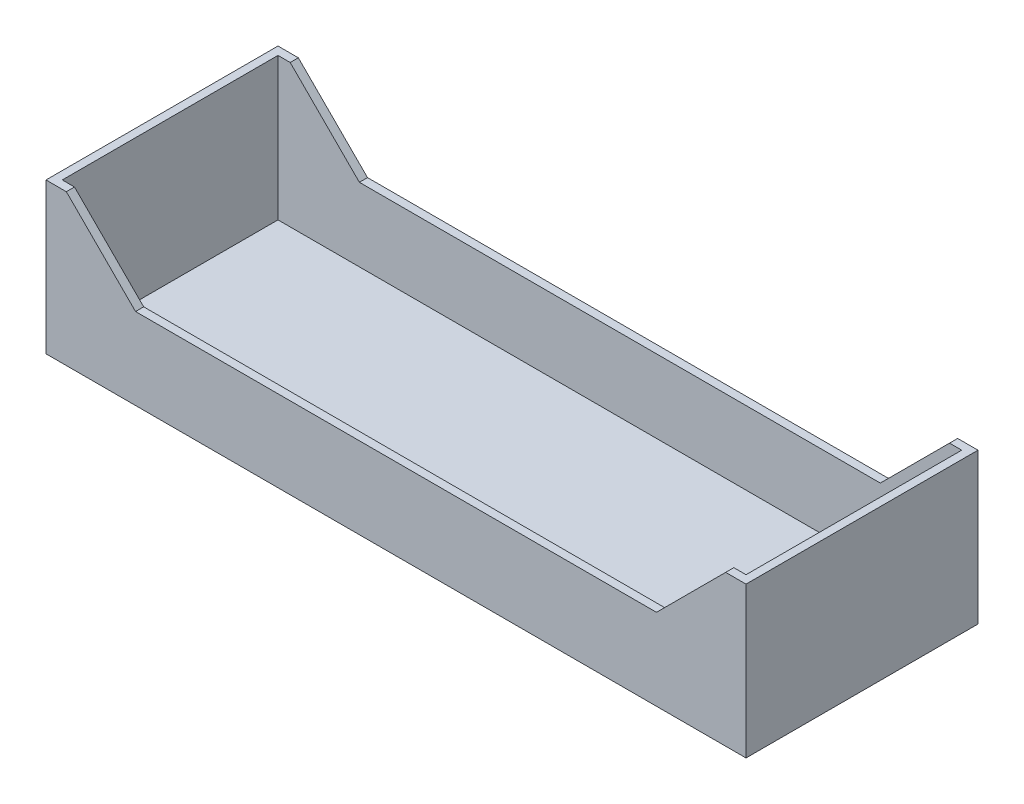
ISO-10303-21;
HEADER;
FILE_DESCRIPTION(('STEP AP214'),'2;1');
FILE_NAME('part.step','',(''),(''),'','','');
FILE_SCHEMA(('AUTOMOTIVE_DESIGN { 1 0 10303 214 1 1 1 1 }'));
ENDSEC;
DATA;
#1=APPLICATION_CONTEXT('core data for automotive mechanical design processes');
#2=APPLICATION_PROTOCOL_DEFINITION('international standard','automotive_design',2000,#1);
#3=PRODUCT_CONTEXT('',#1,'mechanical');
#4=PRODUCT('Part','Part','',(#3));
#5=PRODUCT_RELATED_PRODUCT_CATEGORY('part','',(#4));
#6=PRODUCT_DEFINITION_FORMATION('','',#4);
#7=PRODUCT_DEFINITION_CONTEXT('part definition',#1,'design');
#8=PRODUCT_DEFINITION('design','',#6,#7);
#9=PRODUCT_DEFINITION_SHAPE('','',#8);
#10=(LENGTH_UNIT() NAMED_UNIT(*) SI_UNIT(.MILLI.,.METRE.));
#11=(NAMED_UNIT(*) PLANE_ANGLE_UNIT() SI_UNIT($,.RADIAN.));
#12=(NAMED_UNIT(*) SI_UNIT($,.STERADIAN.) SOLID_ANGLE_UNIT());
#13=UNCERTAINTY_MEASURE_WITH_UNIT(LENGTH_MEASURE(1.E-05),#10,'distance_accuracy_value','');
#14=(GEOMETRIC_REPRESENTATION_CONTEXT(3) GLOBAL_UNCERTAINTY_ASSIGNED_CONTEXT((#13)) GLOBAL_UNIT_ASSIGNED_CONTEXT((#10,
#11,#12)) REPRESENTATION_CONTEXT('',''));
#15=CARTESIAN_POINT('',(0.,0.,0.));
#16=DIRECTION('',(0.,0.,1.));
#17=DIRECTION('',(1.,0.,0.));
#18=AXIS2_PLACEMENT_3D('',#15,#16,#17);
#19=CARTESIAN_POINT('',(0.,37.,0.));
#20=DIRECTION('',(0.,-1.,0.));
#21=DIRECTION('',(0.,0.,-1.));
#22=AXIS2_PLACEMENT_3D('',#19,#20,#21);
#23=PLANE('',#22);
#24=DIRECTION('',(-1.,0.,0.));
#25=VECTOR('',#24,1.);
#26=CARTESIAN_POINT('',(-86.,37.,-28.5));
#27=LINE('',#26,#25);
#28=CARTESIAN_POINT('',(86.,37.,-28.5));
#29=VERTEX_POINT('',#28);
#30=CARTESIAN_POINT('',(81.,37.,-28.5));
#31=VERTEX_POINT('',#30);
#32=EDGE_CURVE('E171',#29,#31,#27,.T.);
#33=ORIENTED_EDGE('',*,*,#32,.T.);
#34=DIRECTION('',(0.,0.,1.));
#35=VECTOR('',#34,1.);
#36=CARTESIAN_POINT('',(81.,37.,-28.5));
#37=LINE('',#36,#35);
#38=CARTESIAN_POINT('',(81.,37.,-26.5));
#39=VERTEX_POINT('',#38);
#40=EDGE_CURVE('E284',#31,#39,#37,.T.);
#41=ORIENTED_EDGE('',*,*,#40,.T.);
#42=DIRECTION('',(-1.,0.,0.));
#43=VECTOR('',#42,1.);
#44=CARTESIAN_POINT('',(-84.,37.,-26.5));
#45=LINE('',#44,#43);
#46=CARTESIAN_POINT('',(84.,37.,-26.5));
#47=VERTEX_POINT('',#46);
#48=EDGE_CURVE('E219',#47,#39,#45,.T.);
#49=ORIENTED_EDGE('',*,*,#48,.F.);
#50=DIRECTION('',(0.,0.,-1.));
#51=VECTOR('',#50,1.);
#52=CARTESIAN_POINT('',(84.,37.,26.5));
#53=LINE('',#52,#51);
#54=CARTESIAN_POINT('',(84.,37.,26.5));
#55=VERTEX_POINT('',#54);
#56=EDGE_CURVE('E228',#55,#47,#53,.T.);
#57=ORIENTED_EDGE('',*,*,#56,.F.);
#58=DIRECTION('',(1.,0.,0.));
#59=VECTOR('',#58,1.);
#60=CARTESIAN_POINT('',(-84.,37.,26.5));
#61=LINE('',#60,#59);
#62=CARTESIAN_POINT('',(81.,37.,26.5));
#63=VERTEX_POINT('',#62);
#64=EDGE_CURVE('E292',#63,#55,#61,.T.);
#65=ORIENTED_EDGE('',*,*,#64,.F.);
#66=CARTESIAN_POINT('',(81.,37.,28.5));
#67=VERTEX_POINT('',#66);
#68=EDGE_CURVE('E213',#63,#67,#37,.T.);
#69=ORIENTED_EDGE('',*,*,#68,.T.);
#70=DIRECTION('',(1.,0.,0.));
#71=VECTOR('',#70,1.);
#72=CARTESIAN_POINT('',(-86.,37.,28.5));
#73=LINE('',#72,#71);
#74=CARTESIAN_POINT('',(86.,37.,28.5));
#75=VERTEX_POINT('',#74);
#76=EDGE_CURVE('E253',#67,#75,#73,.T.);
#77=ORIENTED_EDGE('',*,*,#76,.T.);
#78=DIRECTION('',(0.,0.,-1.));
#79=VECTOR('',#78,1.);
#80=CARTESIAN_POINT('',(86.,37.,28.5));
#81=LINE('',#80,#79);
#82=EDGE_CURVE('E172',#75,#29,#81,.T.);
#83=ORIENTED_EDGE('',*,*,#82,.T.);
#84=EDGE_LOOP('',(#33,#41,#49,#57,#65,#69,#77,#83));
#85=FACE_BOUND('',#84,.T.);
#86=ADVANCED_FACE('F35',(#85),#23,.F.);
#87=CARTESIAN_POINT('',(-86.,2.,28.5));
#88=DIRECTION('',(1.,0.,0.));
#89=DIRECTION('',(0.,0.,-1.));
#90=AXIS2_PLACEMENT_3D('',#87,#88,#89);
#91=PLANE('',#90);
#92=DIRECTION('',(0.,0.,1.));
#93=VECTOR('',#92,1.);
#94=CARTESIAN_POINT('',(-86.,0.,28.5));
#95=LINE('',#94,#93);
#96=CARTESIAN_POINT('',(-86.,0.,-28.5));
#97=VERTEX_POINT('',#96);
#98=CARTESIAN_POINT('',(-86.,0.,28.5));
#99=VERTEX_POINT('',#98);
#100=EDGE_CURVE('E175',#97,#99,#95,.T.);
#101=ORIENTED_EDGE('',*,*,#100,.T.);
#102=DIRECTION('',(0.,-1.,0.));
#103=VECTOR('',#102,1.);
#104=CARTESIAN_POINT('',(-86.,2.,28.5));
#105=LINE('',#104,#103);
#106=CARTESIAN_POINT('',(-86.,37.,28.5));
#107=VERTEX_POINT('',#106);
#108=EDGE_CURVE('E196',#107,#99,#105,.T.);
#109=ORIENTED_EDGE('',*,*,#108,.F.);
#110=DIRECTION('',(0.,0.,1.));
#111=VECTOR('',#110,1.);
#112=CARTESIAN_POINT('',(-86.,37.,28.5));
#113=LINE('',#112,#111);
#114=CARTESIAN_POINT('',(-86.,37.,-28.5));
#115=VERTEX_POINT('',#114);
#116=EDGE_CURVE('E252',#115,#107,#113,.T.);
#117=ORIENTED_EDGE('',*,*,#116,.F.);
#118=DIRECTION('',(0.,-1.,0.));
#119=VECTOR('',#118,1.);
#120=CARTESIAN_POINT('',(-86.,2.,-28.5));
#121=LINE('',#120,#119);
#122=EDGE_CURVE('E169',#115,#97,#121,.T.);
#123=ORIENTED_EDGE('',*,*,#122,.T.);
#124=EDGE_LOOP('',(#101,#109,#117,#123));
#125=FACE_BOUND('',#124,.T.);
#126=ADVANCED_FACE('F37',(#125),#91,.F.);
#127=CARTESIAN_POINT('',(-86.,2.,28.5));
#128=DIRECTION('',(0.,0.,-1.));
#129=DIRECTION('',(-1.,0.,0.));
#130=AXIS2_PLACEMENT_3D('',#127,#128,#129);
#131=PLANE('',#130);
#132=ORIENTED_EDGE('',*,*,#76,.F.);
#133=DIRECTION('',(0.707106781186546,0.707106781186549,0.));
#134=VECTOR('',#133,1.);
#135=CARTESIAN_POINT('',(81.,37.,28.5));
#136=LINE('',#135,#134);
#137=CARTESIAN_POINT('',(64.0000000000001,20.,28.5));
#138=VERTEX_POINT('',#137);
#139=EDGE_CURVE('E154',#138,#67,#136,.T.);
#140=ORIENTED_EDGE('',*,*,#139,.F.);
#141=DIRECTION('',(1.,0.,0.));
#142=VECTOR('',#141,1.);
#143=CARTESIAN_POINT('',(-64.0000000000001,20.,28.5));
#144=LINE('',#143,#142);
#145=CARTESIAN_POINT('',(-64.0000000000001,20.,28.5));
#146=VERTEX_POINT('',#145);
#147=EDGE_CURVE('E277',#146,#138,#144,.T.);
#148=ORIENTED_EDGE('',*,*,#147,.F.);
#149=DIRECTION('',(0.707106781186546,-0.707106781186549,0.));
#150=VECTOR('',#149,1.);
#151=CARTESIAN_POINT('',(-81.,37.,28.5));
#152=LINE('',#151,#150);
#153=CARTESIAN_POINT('',(-81.,37.,28.5));
#154=VERTEX_POINT('',#153);
#155=EDGE_CURVE('E275',#154,#146,#152,.T.);
#156=ORIENTED_EDGE('',*,*,#155,.F.);
#157=EDGE_CURVE('E177',#107,#154,#73,.T.);
#158=ORIENTED_EDGE('',*,*,#157,.F.);
#159=ORIENTED_EDGE('',*,*,#108,.T.);
#160=DIRECTION('',(1.,0.,0.));
#161=VECTOR('',#160,1.);
#162=CARTESIAN_POINT('',(-86.,0.,28.5));
#163=LINE('',#162,#161);
#164=CARTESIAN_POINT('',(86.,0.,28.5));
#165=VERTEX_POINT('',#164);
#166=EDGE_CURVE('E183',#99,#165,#163,.T.);
#167=ORIENTED_EDGE('',*,*,#166,.T.);
#168=DIRECTION('',(0.,-1.,0.));
#169=VECTOR('',#168,1.);
#170=CARTESIAN_POINT('',(86.,2.,28.5));
#171=LINE('',#170,#169);
#172=EDGE_CURVE('E193',#75,#165,#171,.T.);
#173=ORIENTED_EDGE('',*,*,#172,.F.);
#174=EDGE_LOOP('',(#132,#140,#148,#156,#158,#159,#167,#173));
#175=FACE_BOUND('',#174,.T.);
#176=ADVANCED_FACE('F264',(#175),#131,.F.);
#177=CARTESIAN_POINT('',(86.,2.,28.5));
#178=DIRECTION('',(-1.,0.,0.));
#179=DIRECTION('',(0.,0.,1.));
#180=AXIS2_PLACEMENT_3D('',#177,#178,#179);
#181=PLANE('',#180);
#182=DIRECTION('',(0.,0.,-1.));
#183=VECTOR('',#182,1.);
#184=CARTESIAN_POINT('',(86.,0.,28.5));
#185=LINE('',#184,#183);
#186=CARTESIAN_POINT('',(86.,0.,-28.5));
#187=VERTEX_POINT('',#186);
#188=EDGE_CURVE('E185',#165,#187,#185,.T.);
#189=ORIENTED_EDGE('',*,*,#188,.T.);
#190=DIRECTION('',(0.,-1.,0.));
#191=VECTOR('',#190,1.);
#192=CARTESIAN_POINT('',(86.,2.,-28.5));
#193=LINE('',#192,#191);
#194=EDGE_CURVE('E190',#29,#187,#193,.T.);
#195=ORIENTED_EDGE('',*,*,#194,.F.);
#196=ORIENTED_EDGE('',*,*,#82,.F.);
#197=ORIENTED_EDGE('',*,*,#172,.T.);
#198=EDGE_LOOP('',(#189,#195,#196,#197));
#199=FACE_BOUND('',#198,.T.);
#200=ADVANCED_FACE('F267',(#199),#181,.F.);
#201=CARTESIAN_POINT('',(-86.,2.,-28.5));
#202=DIRECTION('',(0.,0.,1.));
#203=DIRECTION('',(1.,0.,0.));
#204=AXIS2_PLACEMENT_3D('',#201,#202,#203);
#205=PLANE('',#204);
#206=DIRECTION('',(1.,0.,0.));
#207=VECTOR('',#206,1.);
#208=CARTESIAN_POINT('',(-64.0000000000001,20.,-28.5));
#209=LINE('',#208,#207);
#210=CARTESIAN_POINT('',(-64.0000000000001,20.,-28.5));
#211=VERTEX_POINT('',#210);
#212=CARTESIAN_POINT('',(64.0000000000001,20.,-28.5));
#213=VERTEX_POINT('',#212);
#214=EDGE_CURVE('E153',#211,#213,#209,.T.);
#215=ORIENTED_EDGE('',*,*,#214,.T.);
#216=DIRECTION('',(0.707106781186546,0.707106781186549,0.));
#217=VECTOR('',#216,1.);
#218=CARTESIAN_POINT('',(81.,37.,-28.5));
#219=LINE('',#218,#217);
#220=EDGE_CURVE('E212',#213,#31,#219,.T.);
#221=ORIENTED_EDGE('',*,*,#220,.T.);
#222=ORIENTED_EDGE('',*,*,#32,.F.);
#223=ORIENTED_EDGE('',*,*,#194,.T.);
#224=DIRECTION('',(-1.,0.,0.));
#225=VECTOR('',#224,1.);
#226=CARTESIAN_POINT('',(-86.,0.,-28.5));
#227=LINE('',#226,#225);
#228=EDGE_CURVE('E187',#187,#97,#227,.T.);
#229=ORIENTED_EDGE('',*,*,#228,.T.);
#230=ORIENTED_EDGE('',*,*,#122,.F.);
#231=CARTESIAN_POINT('',(-81.,37.,-28.5));
#232=VERTEX_POINT('',#231);
#233=EDGE_CURVE('E161',#232,#115,#27,.T.);
#234=ORIENTED_EDGE('',*,*,#233,.F.);
#235=DIRECTION('',(0.707106781186546,-0.707106781186549,0.));
#236=VECTOR('',#235,1.);
#237=CARTESIAN_POINT('',(-81.,37.,-28.5));
#238=LINE('',#237,#236);
#239=EDGE_CURVE('E145',#232,#211,#238,.T.);
#240=ORIENTED_EDGE('',*,*,#239,.T.);
#241=EDGE_LOOP('',(#215,#221,#222,#223,#229,#230,#234,#240));
#242=FACE_BOUND('',#241,.T.);
#243=ADVANCED_FACE('F167',(#242),#205,.F.);
#244=CARTESIAN_POINT('',(0.,0.,0.));
#245=DIRECTION('',(0.,-1.,0.));
#246=DIRECTION('',(0.,0.,-1.));
#247=AXIS2_PLACEMENT_3D('',#244,#245,#246);
#248=PLANE('',#247);
#249=ORIENTED_EDGE('',*,*,#100,.F.);
#250=ORIENTED_EDGE('',*,*,#228,.F.);
#251=ORIENTED_EDGE('',*,*,#188,.F.);
#252=ORIENTED_EDGE('',*,*,#166,.F.);
#253=EDGE_LOOP('',(#249,#250,#251,#252));
#254=FACE_BOUND('',#253,.T.);
#255=ADVANCED_FACE('F271',(#254),#248,.T.);
#256=ORIENTED_EDGE('',*,*,#157,.T.);
#257=DIRECTION('',(0.,0.,1.));
#258=VECTOR('',#257,1.);
#259=CARTESIAN_POINT('',(-81.,37.,-28.5));
#260=LINE('',#259,#258);
#261=CARTESIAN_POINT('',(-81.,37.,26.5));
#262=VERTEX_POINT('',#261);
#263=EDGE_CURVE('E165',#262,#154,#260,.T.);
#264=ORIENTED_EDGE('',*,*,#263,.F.);
#265=CARTESIAN_POINT('',(-84.,37.,26.5));
#266=VERTEX_POINT('',#265);
#267=EDGE_CURVE('E293',#266,#262,#61,.T.);
#268=ORIENTED_EDGE('',*,*,#267,.F.);
#269=DIRECTION('',(0.,0.,1.));
#270=VECTOR('',#269,1.);
#271=CARTESIAN_POINT('',(-84.,37.,26.5));
#272=LINE('',#271,#270);
#273=CARTESIAN_POINT('',(-84.,37.,-26.5));
#274=VERTEX_POINT('',#273);
#275=EDGE_CURVE('E244',#274,#266,#272,.T.);
#276=ORIENTED_EDGE('',*,*,#275,.F.);
#277=CARTESIAN_POINT('',(-81.,37.,-26.5));
#278=VERTEX_POINT('',#277);
#279=EDGE_CURVE('E164',#278,#274,#45,.T.);
#280=ORIENTED_EDGE('',*,*,#279,.F.);
#281=EDGE_CURVE('E58',#232,#278,#260,.T.);
#282=ORIENTED_EDGE('',*,*,#281,.F.);
#283=ORIENTED_EDGE('',*,*,#233,.T.);
#284=ORIENTED_EDGE('',*,*,#116,.T.);
#285=EDGE_LOOP('',(#256,#264,#268,#276,#280,#282,#283,#284));
#286=FACE_BOUND('',#285,.T.);
#287=ADVANCED_FACE('F159',(#286),#23,.F.);
#288=CARTESIAN_POINT('',(-84.,37.,26.5));
#289=DIRECTION('',(1.,0.,0.));
#290=DIRECTION('',(0.,0.,-1.));
#291=AXIS2_PLACEMENT_3D('',#288,#289,#290);
#292=PLANE('',#291);
#293=DIRECTION('',(0.,0.,1.));
#294=VECTOR('',#293,1.);
#295=CARTESIAN_POINT('',(-84.,2.,26.5));
#296=LINE('',#295,#294);
#297=CARTESIAN_POINT('',(-84.,2.,-26.5));
#298=VERTEX_POINT('',#297);
#299=CARTESIAN_POINT('',(-84.,2.,26.5));
#300=VERTEX_POINT('',#299);
#301=EDGE_CURVE('E232',#298,#300,#296,.T.);
#302=ORIENTED_EDGE('',*,*,#301,.F.);
#303=DIRECTION('',(0.,-1.,0.));
#304=VECTOR('',#303,1.);
#305=CARTESIAN_POINT('',(-84.,37.,-26.5));
#306=LINE('',#305,#304);
#307=EDGE_CURVE('E225',#274,#298,#306,.T.);
#308=ORIENTED_EDGE('',*,*,#307,.F.);
#309=ORIENTED_EDGE('',*,*,#275,.T.);
#310=DIRECTION('',(0.,-1.,0.));
#311=VECTOR('',#310,1.);
#312=CARTESIAN_POINT('',(-84.,37.,26.5));
#313=LINE('',#312,#311);
#314=EDGE_CURVE('E249',#266,#300,#313,.T.);
#315=ORIENTED_EDGE('',*,*,#314,.T.);
#316=EDGE_LOOP('',(#302,#308,#309,#315));
#317=FACE_BOUND('',#316,.T.);
#318=ADVANCED_FACE('F310',(#317),#292,.T.);
#319=CARTESIAN_POINT('',(-84.,37.,26.5));
#320=DIRECTION('',(0.,0.,-1.));
#321=DIRECTION('',(-1.,0.,0.));
#322=AXIS2_PLACEMENT_3D('',#319,#320,#321);
#323=PLANE('',#322);
#324=DIRECTION('',(-0.707106781186546,-0.707106781186549,0.));
#325=VECTOR('',#324,1.);
#326=CARTESIAN_POINT('',(-1.49999999999971,-45.5,26.5));
#327=LINE('',#326,#325);
#328=CARTESIAN_POINT('',(64.0000000000001,20.,26.5));
#329=VERTEX_POINT('',#328);
#330=EDGE_CURVE('E236',#63,#329,#327,.T.);
#331=ORIENTED_EDGE('',*,*,#330,.F.);
#332=ORIENTED_EDGE('',*,*,#64,.T.);
#333=DIRECTION('',(0.,-1.,0.));
#334=VECTOR('',#333,1.);
#335=CARTESIAN_POINT('',(84.,37.,26.5));
#336=LINE('',#335,#334);
#337=CARTESIAN_POINT('',(84.,2.,26.5));
#338=VERTEX_POINT('',#337);
#339=EDGE_CURVE('E247',#55,#338,#336,.T.);
#340=ORIENTED_EDGE('',*,*,#339,.T.);
#341=DIRECTION('',(1.,0.,0.));
#342=VECTOR('',#341,1.);
#343=CARTESIAN_POINT('',(-84.,2.,26.5));
#344=LINE('',#343,#342);
#345=EDGE_CURVE('E235',#300,#338,#344,.T.);
#346=ORIENTED_EDGE('',*,*,#345,.F.);
#347=ORIENTED_EDGE('',*,*,#314,.F.);
#348=ORIENTED_EDGE('',*,*,#267,.T.);
#349=DIRECTION('',(-0.707106781186546,0.707106781186549,0.));
#350=VECTOR('',#349,1.);
#351=CARTESIAN_POINT('',(-82.5,38.5,26.5));
#352=LINE('',#351,#350);
#353=CARTESIAN_POINT('',(-64.0000000000001,20.,26.5));
#354=VERTEX_POINT('',#353);
#355=EDGE_CURVE('E285',#354,#262,#352,.T.);
#356=ORIENTED_EDGE('',*,*,#355,.F.);
#357=DIRECTION('',(-1.,0.,0.));
#358=VECTOR('',#357,1.);
#359=CARTESIAN_POINT('',(-84.,20.,26.5));
#360=LINE('',#359,#358);
#361=EDGE_CURVE('E289',#329,#354,#360,.T.);
#362=ORIENTED_EDGE('',*,*,#361,.F.);
#363=EDGE_LOOP('',(#331,#332,#340,#346,#347,#348,#356,#362));
#364=FACE_BOUND('',#363,.T.);
#365=ADVANCED_FACE('F301',(#364),#323,.T.);
#366=CARTESIAN_POINT('',(84.,37.,26.5));
#367=DIRECTION('',(-1.,0.,0.));
#368=DIRECTION('',(0.,0.,1.));
#369=AXIS2_PLACEMENT_3D('',#366,#367,#368);
#370=PLANE('',#369);
#371=DIRECTION('',(0.,0.,-1.));
#372=VECTOR('',#371,1.);
#373=CARTESIAN_POINT('',(84.,2.,26.5));
#374=LINE('',#373,#372);
#375=CARTESIAN_POINT('',(84.,2.,-26.5));
#376=VERTEX_POINT('',#375);
#377=EDGE_CURVE('E239',#338,#376,#374,.T.);
#378=ORIENTED_EDGE('',*,*,#377,.F.);
#379=ORIENTED_EDGE('',*,*,#339,.F.);
#380=ORIENTED_EDGE('',*,*,#56,.T.);
#381=DIRECTION('',(0.,-1.,0.));
#382=VECTOR('',#381,1.);
#383=CARTESIAN_POINT('',(84.,37.,-26.5));
#384=LINE('',#383,#382);
#385=EDGE_CURVE('E221',#47,#376,#384,.T.);
#386=ORIENTED_EDGE('',*,*,#385,.T.);
#387=EDGE_LOOP('',(#378,#379,#380,#386));
#388=FACE_BOUND('',#387,.T.);
#389=ADVANCED_FACE('F305',(#388),#370,.T.);
#390=CARTESIAN_POINT('',(-84.,37.,-26.5));
#391=DIRECTION('',(0.,0.,1.));
#392=DIRECTION('',(1.,0.,0.));
#393=AXIS2_PLACEMENT_3D('',#390,#391,#392);
#394=PLANE('',#393);
#395=DIRECTION('',(0.707106781186546,0.707106781186549,0.));
#396=VECTOR('',#395,1.);
#397=CARTESIAN_POINT('',(-1.49999999999971,-45.5,-26.5));
#398=LINE('',#397,#396);
#399=CARTESIAN_POINT('',(64.0000000000001,20.,-26.5));
#400=VERTEX_POINT('',#399);
#401=EDGE_CURVE('E11',#400,#39,#398,.T.);
#402=ORIENTED_EDGE('',*,*,#401,.F.);
#403=DIRECTION('',(1.,0.,0.));
#404=VECTOR('',#403,1.);
#405=CARTESIAN_POINT('',(-84.,20.,-26.5));
#406=LINE('',#405,#404);
#407=CARTESIAN_POINT('',(-64.0000000000001,20.,-26.5));
#408=VERTEX_POINT('',#407);
#409=EDGE_CURVE('E43',#408,#400,#406,.T.);
#410=ORIENTED_EDGE('',*,*,#409,.F.);
#411=DIRECTION('',(0.707106781186546,-0.707106781186549,0.));
#412=VECTOR('',#411,1.);
#413=CARTESIAN_POINT('',(-82.5,38.5,-26.5));
#414=LINE('',#413,#412);
#415=EDGE_CURVE('E199',#278,#408,#414,.T.);
#416=ORIENTED_EDGE('',*,*,#415,.F.);
#417=ORIENTED_EDGE('',*,*,#279,.T.);
#418=ORIENTED_EDGE('',*,*,#307,.T.);
#419=DIRECTION('',(-1.,0.,0.));
#420=VECTOR('',#419,1.);
#421=CARTESIAN_POINT('',(-84.,2.,-26.5));
#422=LINE('',#421,#420);
#423=EDGE_CURVE('E242',#376,#298,#422,.T.);
#424=ORIENTED_EDGE('',*,*,#423,.F.);
#425=ORIENTED_EDGE('',*,*,#385,.F.);
#426=ORIENTED_EDGE('',*,*,#48,.T.);
#427=EDGE_LOOP('',(#402,#410,#416,#417,#418,#424,#425,#426));
#428=FACE_BOUND('',#427,.T.);
#429=ADVANCED_FACE('F217',(#428),#394,.T.);
#430=CARTESIAN_POINT('',(0.,2.,0.));
#431=DIRECTION('',(0.,-1.,0.));
#432=DIRECTION('',(0.,0.,-1.));
#433=AXIS2_PLACEMENT_3D('',#430,#431,#432);
#434=PLANE('',#433);
#435=ORIENTED_EDGE('',*,*,#423,.T.);
#436=ORIENTED_EDGE('',*,*,#301,.T.);
#437=ORIENTED_EDGE('',*,*,#345,.T.);
#438=ORIENTED_EDGE('',*,*,#377,.T.);
#439=EDGE_LOOP('',(#435,#436,#437,#438));
#440=FACE_BOUND('',#439,.T.);
#441=ADVANCED_FACE('F307',(#440),#434,.F.);
#442=CARTESIAN_POINT('',(-81.,37.,-28.5));
#443=DIRECTION('',(-0.707106781186549,-0.707106781186546,0.));
#444=DIRECTION('',(0.707106781186546,-0.707106781186549,0.));
#445=AXIS2_PLACEMENT_3D('',#442,#443,#444);
#446=PLANE('',#445);
#447=ORIENTED_EDGE('',*,*,#415,.T.);
#448=DIRECTION('',(0.,0.,1.));
#449=VECTOR('',#448,1.);
#450=CARTESIAN_POINT('',(-64.0000000000001,20.,-28.5));
#451=LINE('',#450,#449);
#452=EDGE_CURVE('E148',#211,#408,#451,.T.);
#453=ORIENTED_EDGE('',*,*,#452,.F.);
#454=ORIENTED_EDGE('',*,*,#239,.F.);
#455=ORIENTED_EDGE('',*,*,#281,.T.);
#456=EDGE_LOOP('',(#447,#453,#454,#455));
#457=FACE_BOUND('',#456,.T.);
#458=ADVANCED_FACE('F146',(#457),#446,.F.);
#459=CARTESIAN_POINT('',(-64.0000000000001,20.,-28.5));
#460=DIRECTION('',(0.,-1.,0.));
#461=DIRECTION('',(1.,0.,0.));
#462=AXIS2_PLACEMENT_3D('',#459,#460,#461);
#463=PLANE('',#462);
#464=ORIENTED_EDGE('',*,*,#409,.T.);
#465=DIRECTION('',(0.,0.,1.));
#466=VECTOR('',#465,1.);
#467=CARTESIAN_POINT('',(64.0000000000001,20.,-28.5));
#468=LINE('',#467,#466);
#469=EDGE_CURVE('E204',#213,#400,#468,.T.);
#470=ORIENTED_EDGE('',*,*,#469,.F.);
#471=ORIENTED_EDGE('',*,*,#214,.F.);
#472=ORIENTED_EDGE('',*,*,#452,.T.);
#473=EDGE_LOOP('',(#464,#470,#471,#472));
#474=FACE_BOUND('',#473,.T.);
#475=ADVANCED_FACE('F203',(#474),#463,.F.);
#476=CARTESIAN_POINT('',(81.,37.,-28.5));
#477=DIRECTION('',(0.707106781186549,-0.707106781186546,0.));
#478=DIRECTION('',(0.707106781186546,0.707106781186549,0.));
#479=AXIS2_PLACEMENT_3D('',#476,#477,#478);
#480=PLANE('',#479);
#481=ORIENTED_EDGE('',*,*,#401,.T.);
#482=ORIENTED_EDGE('',*,*,#40,.F.);
#483=ORIENTED_EDGE('',*,*,#220,.F.);
#484=ORIENTED_EDGE('',*,*,#469,.T.);
#485=EDGE_LOOP('',(#481,#482,#483,#484));
#486=FACE_BOUND('',#485,.T.);
#487=ADVANCED_FACE('F209',(#486),#480,.F.);
#488=ORIENTED_EDGE('',*,*,#330,.T.);
#489=EDGE_CURVE('E214',#329,#138,#468,.T.);
#490=ORIENTED_EDGE('',*,*,#489,.T.);
#491=ORIENTED_EDGE('',*,*,#139,.T.);
#492=ORIENTED_EDGE('',*,*,#68,.F.);
#493=EDGE_LOOP('',(#488,#490,#491,#492));
#494=FACE_BOUND('',#493,.T.);
#495=ADVANCED_FACE('F317',(#494),#480,.F.);
#496=ORIENTED_EDGE('',*,*,#361,.T.);
#497=EDGE_CURVE('E50',#354,#146,#451,.T.);
#498=ORIENTED_EDGE('',*,*,#497,.T.);
#499=ORIENTED_EDGE('',*,*,#147,.T.);
#500=ORIENTED_EDGE('',*,*,#489,.F.);
#501=EDGE_LOOP('',(#496,#498,#499,#500));
#502=FACE_BOUND('',#501,.T.);
#503=ADVANCED_FACE('F315',(#502),#463,.F.);
#504=ORIENTED_EDGE('',*,*,#355,.T.);
#505=ORIENTED_EDGE('',*,*,#263,.T.);
#506=ORIENTED_EDGE('',*,*,#155,.T.);
#507=ORIENTED_EDGE('',*,*,#497,.F.);
#508=EDGE_LOOP('',(#504,#505,#506,#507));
#509=FACE_BOUND('',#508,.T.);
#510=ADVANCED_FACE('F312',(#509),#446,.F.);
#511=CLOSED_SHELL('',(#86,#126,#176,#200,#243,#255,#287,#318,#365,#389,#429,#441,#458,#475,#487,
#495,#503,#510));
#512=MANIFOLD_SOLID_BREP('B2',#511);
#513=ADVANCED_BREP_SHAPE_REPRESENTATION('',(#18,#512),#14);
#514=SHAPE_DEFINITION_REPRESENTATION(#9,#513);
ENDSEC;
END-ISO-10303-21;
